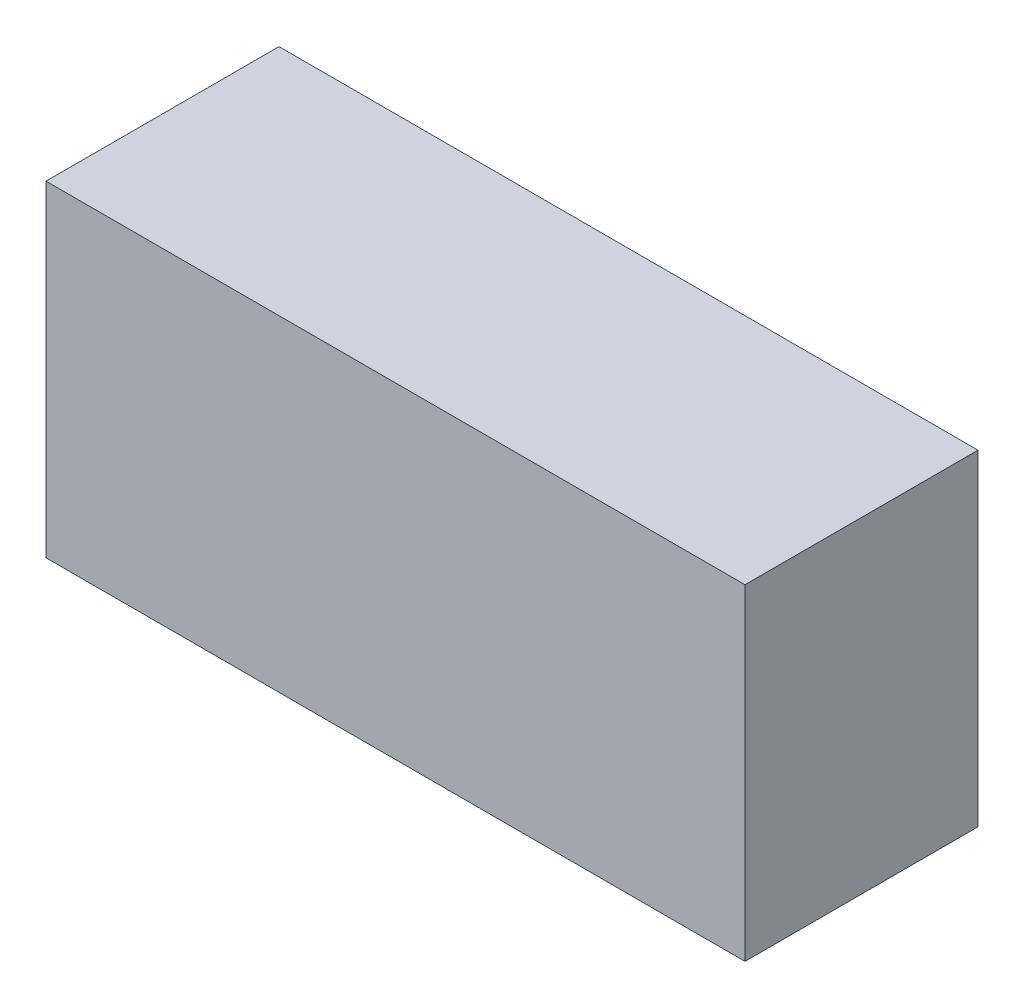
ISO-10303-21;
HEADER;
FILE_DESCRIPTION(('STEP AP214'),'2;1');
FILE_NAME('part.step','',(''),(''),'','','');
FILE_SCHEMA(('AUTOMOTIVE_DESIGN { 1 0 10303 214 1 1 1 1 }'));
ENDSEC;
DATA;
#1=APPLICATION_CONTEXT('core data for automotive mechanical design processes');
#2=APPLICATION_PROTOCOL_DEFINITION('international standard','automotive_design',2000,#1);
#3=PRODUCT_CONTEXT('',#1,'mechanical');
#4=PRODUCT('Part','Part','',(#3));
#5=PRODUCT_RELATED_PRODUCT_CATEGORY('part','',(#4));
#6=PRODUCT_DEFINITION_FORMATION('','',#4);
#7=PRODUCT_DEFINITION_CONTEXT('part definition',#1,'design');
#8=PRODUCT_DEFINITION('design','',#6,#7);
#9=PRODUCT_DEFINITION_SHAPE('','',#8);
#10=(LENGTH_UNIT() NAMED_UNIT(*) SI_UNIT(.MILLI.,.METRE.));
#11=(NAMED_UNIT(*) PLANE_ANGLE_UNIT() SI_UNIT($,.RADIAN.));
#12=(NAMED_UNIT(*) SI_UNIT($,.STERADIAN.) SOLID_ANGLE_UNIT());
#13=UNCERTAINTY_MEASURE_WITH_UNIT(LENGTH_MEASURE(1.E-05),#10,'distance_accuracy_value','');
#14=(GEOMETRIC_REPRESENTATION_CONTEXT(3) GLOBAL_UNCERTAINTY_ASSIGNED_CONTEXT((#13)) GLOBAL_UNIT_ASSIGNED_CONTEXT((#10,
#11,#12)) REPRESENTATION_CONTEXT('',''));
#15=CARTESIAN_POINT('',(0.,0.,0.));
#16=DIRECTION('',(0.,0.,1.));
#17=DIRECTION('',(1.,0.,0.));
#18=AXIS2_PLACEMENT_3D('',#15,#16,#17);
#19=CARTESIAN_POINT('',(-37.5,38.,12.5));
#20=DIRECTION('',(1.,0.,0.));
#21=DIRECTION('',(0.,0.,-1.));
#22=AXIS2_PLACEMENT_3D('',#19,#20,#21);
#23=PLANE('',#22);
#24=DIRECTION('',(0.,0.,1.));
#25=VECTOR('',#24,1.);
#26=CARTESIAN_POINT('',(-37.5,3.,12.5));
#27=LINE('',#26,#25);
#28=CARTESIAN_POINT('',(-37.5,3.,12.5));
#29=VERTEX_POINT('',#28);
#30=CARTESIAN_POINT('',(-37.5,3.,37.5));
#31=VERTEX_POINT('',#30);
#32=EDGE_CURVE('E106',#29,#31,#27,.T.);
#33=ORIENTED_EDGE('',*,*,#32,.T.);
#34=DIRECTION('',(0.,-1.,0.));
#35=VECTOR('',#34,1.);
#36=CARTESIAN_POINT('',(-37.5,38.,37.5));
#37=LINE('',#36,#35);
#38=CARTESIAN_POINT('',(-37.5,38.,37.5));
#39=VERTEX_POINT('',#38);
#40=EDGE_CURVE('E11',#39,#31,#37,.T.);
#41=ORIENTED_EDGE('',*,*,#40,.F.);
#42=DIRECTION('',(0.,0.,1.));
#43=VECTOR('',#42,1.);
#44=CARTESIAN_POINT('',(-37.5,38.,12.5));
#45=LINE('',#44,#43);
#46=CARTESIAN_POINT('',(-37.5,38.,12.5));
#47=VERTEX_POINT('',#46);
#48=EDGE_CURVE('E94',#47,#39,#45,.T.);
#49=ORIENTED_EDGE('',*,*,#48,.F.);
#50=DIRECTION('',(0.,-1.,0.));
#51=VECTOR('',#50,1.);
#52=CARTESIAN_POINT('',(-37.5,38.,12.5));
#53=LINE('',#52,#51);
#54=EDGE_CURVE('E105',#47,#29,#53,.T.);
#55=ORIENTED_EDGE('',*,*,#54,.T.);
#56=EDGE_LOOP('',(#33,#41,#49,#55));
#57=FACE_BOUND('',#56,.T.);
#58=ADVANCED_FACE('F43',(#57),#23,.F.);
#59=CARTESIAN_POINT('',(-37.5,38.,37.5));
#60=DIRECTION('',(0.,0.,-1.));
#61=DIRECTION('',(-1.,0.,0.));
#62=AXIS2_PLACEMENT_3D('',#59,#60,#61);
#63=PLANE('',#62);
#64=DIRECTION('',(1.,0.,0.));
#65=VECTOR('',#64,1.);
#66=CARTESIAN_POINT('',(-37.5,3.,37.5));
#67=LINE('',#66,#65);
#68=CARTESIAN_POINT('',(37.5,3.,37.5));
#69=VERTEX_POINT('',#68);
#70=EDGE_CURVE('E98',#31,#69,#67,.T.);
#71=ORIENTED_EDGE('',*,*,#70,.T.);
#72=DIRECTION('',(0.,-1.,0.));
#73=VECTOR('',#72,1.);
#74=CARTESIAN_POINT('',(37.5,38.,37.5));
#75=LINE('',#74,#73);
#76=CARTESIAN_POINT('',(37.5,38.,37.5));
#77=VERTEX_POINT('',#76);
#78=EDGE_CURVE('E51',#77,#69,#75,.T.);
#79=ORIENTED_EDGE('',*,*,#78,.F.);
#80=DIRECTION('',(1.,0.,0.));
#81=VECTOR('',#80,1.);
#82=CARTESIAN_POINT('',(-37.5,38.,37.5));
#83=LINE('',#82,#81);
#84=EDGE_CURVE('E90',#39,#77,#83,.T.);
#85=ORIENTED_EDGE('',*,*,#84,.F.);
#86=ORIENTED_EDGE('',*,*,#40,.T.);
#87=EDGE_LOOP('',(#71,#79,#85,#86));
#88=FACE_BOUND('',#87,.T.);
#89=ADVANCED_FACE('F100',(#88),#63,.F.);
#90=CARTESIAN_POINT('',(37.5,38.,12.5));
#91=DIRECTION('',(-1.,0.,0.));
#92=DIRECTION('',(0.,0.,1.));
#93=AXIS2_PLACEMENT_3D('',#90,#91,#92);
#94=PLANE('',#93);
#95=DIRECTION('',(0.,0.,-1.));
#96=VECTOR('',#95,1.);
#97=CARTESIAN_POINT('',(37.5,3.,12.5));
#98=LINE('',#97,#96);
#99=CARTESIAN_POINT('',(37.5,3.,12.5));
#100=VERTEX_POINT('',#99);
#101=EDGE_CURVE('E77',#69,#100,#98,.T.);
#102=ORIENTED_EDGE('',*,*,#101,.T.);
#103=DIRECTION('',(0.,-1.,0.));
#104=VECTOR('',#103,1.);
#105=CARTESIAN_POINT('',(37.5,38.,12.5));
#106=LINE('',#105,#104);
#107=CARTESIAN_POINT('',(37.5,38.,12.5));
#108=VERTEX_POINT('',#107);
#109=EDGE_CURVE('E97',#108,#100,#106,.T.);
#110=ORIENTED_EDGE('',*,*,#109,.F.);
#111=DIRECTION('',(0.,0.,-1.));
#112=VECTOR('',#111,1.);
#113=CARTESIAN_POINT('',(37.5,38.,12.5));
#114=LINE('',#113,#112);
#115=EDGE_CURVE('E95',#77,#108,#114,.T.);
#116=ORIENTED_EDGE('',*,*,#115,.F.);
#117=ORIENTED_EDGE('',*,*,#78,.T.);
#118=EDGE_LOOP('',(#102,#110,#116,#117));
#119=FACE_BOUND('',#118,.T.);
#120=ADVANCED_FACE('F99',(#119),#94,.F.);
#121=CARTESIAN_POINT('',(-37.5,38.,12.5));
#122=DIRECTION('',(0.,0.,1.));
#123=DIRECTION('',(1.,0.,0.));
#124=AXIS2_PLACEMENT_3D('',#121,#122,#123);
#125=PLANE('',#124);
#126=DIRECTION('',(-1.,0.,0.));
#127=VECTOR('',#126,1.);
#128=CARTESIAN_POINT('',(-37.5,3.,12.5));
#129=LINE('',#128,#127);
#130=EDGE_CURVE('E85',#100,#29,#129,.T.);
#131=ORIENTED_EDGE('',*,*,#130,.T.);
#132=ORIENTED_EDGE('',*,*,#54,.F.);
#133=DIRECTION('',(-1.,0.,0.));
#134=VECTOR('',#133,1.);
#135=CARTESIAN_POINT('',(-37.5,38.,12.5));
#136=LINE('',#135,#134);
#137=EDGE_CURVE('E56',#108,#47,#136,.T.);
#138=ORIENTED_EDGE('',*,*,#137,.F.);
#139=ORIENTED_EDGE('',*,*,#109,.T.);
#140=EDGE_LOOP('',(#131,#132,#138,#139));
#141=FACE_BOUND('',#140,.T.);
#142=ADVANCED_FACE('F114',(#141),#125,.F.);
#143=CARTESIAN_POINT('',(0.,38.,0.));
#144=DIRECTION('',(0.,1.,0.));
#145=DIRECTION('',(0.,0.,1.));
#146=AXIS2_PLACEMENT_3D('',#143,#144,#145);
#147=PLANE('',#146);
#148=ORIENTED_EDGE('',*,*,#48,.T.);
#149=ORIENTED_EDGE('',*,*,#84,.T.);
#150=ORIENTED_EDGE('',*,*,#115,.T.);
#151=ORIENTED_EDGE('',*,*,#137,.T.);
#152=EDGE_LOOP('',(#148,#149,#150,#151));
#153=FACE_BOUND('',#152,.T.);
#154=ADVANCED_FACE('F89',(#153),#147,.T.);
#155=CARTESIAN_POINT('',(0.,3.,0.));
#156=DIRECTION('',(0.,1.,0.));
#157=DIRECTION('',(0.,0.,1.));
#158=AXIS2_PLACEMENT_3D('',#155,#156,#157);
#159=PLANE('',#158);
#160=ORIENTED_EDGE('',*,*,#32,.F.);
#161=ORIENTED_EDGE('',*,*,#130,.F.);
#162=ORIENTED_EDGE('',*,*,#101,.F.);
#163=ORIENTED_EDGE('',*,*,#70,.F.);
#164=EDGE_LOOP('',(#160,#161,#162,#163));
#165=FACE_BOUND('',#164,.T.);
#166=ADVANCED_FACE('F117',(#165),#159,.F.);
#167=CLOSED_SHELL('',(#58,#89,#120,#142,#154,#166));
#168=MANIFOLD_SOLID_BREP('B2',#167);
#169=ADVANCED_BREP_SHAPE_REPRESENTATION('',(#18,#168),#14);
#170=SHAPE_DEFINITION_REPRESENTATION(#9,#169);
ENDSEC;
END-ISO-10303-21;
